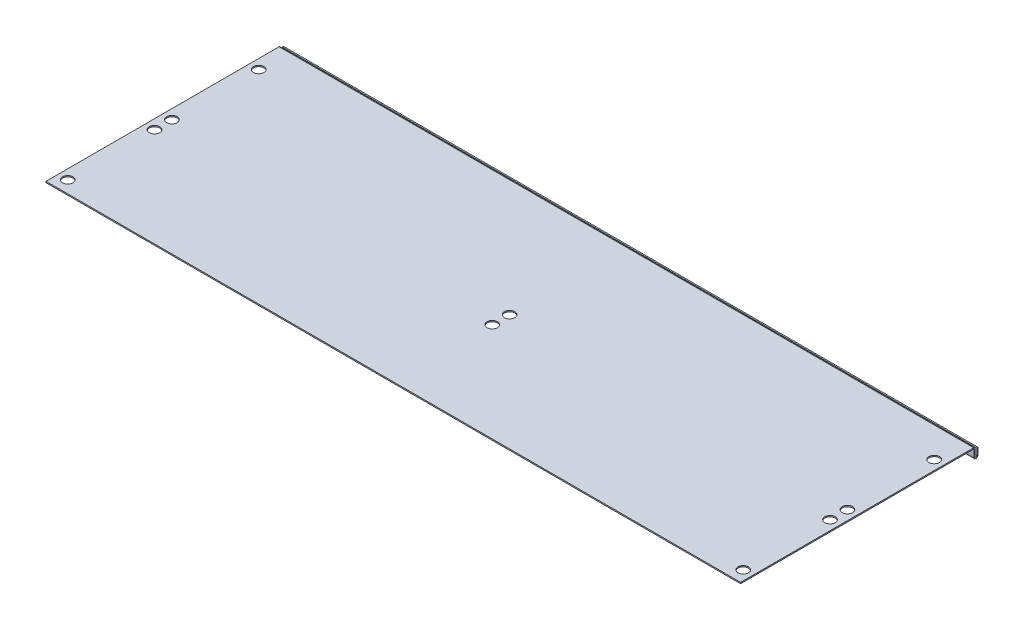
ISO-10303-21;
HEADER;
FILE_DESCRIPTION(('STEP AP214'),'2;1');
FILE_NAME('part.step','',(''),(''),'','','');
FILE_SCHEMA(('AUTOMOTIVE_DESIGN { 1 0 10303 214 1 1 1 1 }'));
ENDSEC;
DATA;
#1=APPLICATION_CONTEXT('core data for automotive mechanical design processes');
#2=APPLICATION_PROTOCOL_DEFINITION('international standard','automotive_design',2000,#1);
#3=PRODUCT_CONTEXT('',#1,'mechanical');
#4=PRODUCT('Part','Part','',(#3));
#5=PRODUCT_RELATED_PRODUCT_CATEGORY('part','',(#4));
#6=PRODUCT_DEFINITION_FORMATION('','',#4);
#7=PRODUCT_DEFINITION_CONTEXT('part definition',#1,'design');
#8=PRODUCT_DEFINITION('design','',#6,#7);
#9=PRODUCT_DEFINITION_SHAPE('','',#8);
#10=(LENGTH_UNIT() NAMED_UNIT(*) SI_UNIT(.MILLI.,.METRE.));
#11=(NAMED_UNIT(*) PLANE_ANGLE_UNIT() SI_UNIT($,.RADIAN.));
#12=(NAMED_UNIT(*) SI_UNIT($,.STERADIAN.) SOLID_ANGLE_UNIT());
#13=UNCERTAINTY_MEASURE_WITH_UNIT(LENGTH_MEASURE(1.E-05),#10,'distance_accuracy_value','');
#14=(GEOMETRIC_REPRESENTATION_CONTEXT(3) GLOBAL_UNCERTAINTY_ASSIGNED_CONTEXT((#13)) GLOBAL_UNIT_ASSIGNED_CONTEXT((#10,
#11,#12)) REPRESENTATION_CONTEXT('',''));
#15=CARTESIAN_POINT('',(0.,0.,0.));
#16=DIRECTION('',(0.,0.,1.));
#17=DIRECTION('',(1.,0.,0.));
#18=AXIS2_PLACEMENT_3D('',#15,#16,#17);
#19=CARTESIAN_POINT('',(200.,-0.7,-67.5));
#20=DIRECTION('',(1.,0.,0.));
#21=DIRECTION('',(0.,0.,-1.));
#22=AXIS2_PLACEMENT_3D('',#19,#20,#21);
#23=PLANE('',#22);
#24=DIRECTION('',(0.,0.,-1.));
#25=VECTOR('',#24,1.);
#26=CARTESIAN_POINT('',(200.,-0.7,-67.5));
#27=LINE('',#26,#25);
#28=CARTESIAN_POINT('',(200.,-0.7,67.5));
#29=VERTEX_POINT('',#28);
#30=CARTESIAN_POINT('',(200.,-0.700000000000008,-66.6));
#31=VERTEX_POINT('',#30);
#32=EDGE_CURVE('E281',#29,#31,#27,.T.);
#33=ORIENTED_EDGE('',*,*,#32,.T.);
#34=DIRECTION('',(0.,1.,0.));
#35=VECTOR('',#34,1.);
#36=CARTESIAN_POINT('',(200.,-0.700000000000008,-66.6));
#37=LINE('',#36,#35);
#38=CARTESIAN_POINT('',(200.,0.,-66.6));
#39=VERTEX_POINT('',#38);
#40=EDGE_CURVE('E204',#31,#39,#37,.T.);
#41=ORIENTED_EDGE('',*,*,#40,.T.);
#42=DIRECTION('',(0.,0.,-1.));
#43=VECTOR('',#42,1.);
#44=CARTESIAN_POINT('',(200.,0.,-67.5));
#45=LINE('',#44,#43);
#46=CARTESIAN_POINT('',(200.,0.,67.5));
#47=VERTEX_POINT('',#46);
#48=EDGE_CURVE('E278',#47,#39,#45,.T.);
#49=ORIENTED_EDGE('',*,*,#48,.F.);
#50=DIRECTION('',(0.,1.,0.));
#51=VECTOR('',#50,1.);
#52=CARTESIAN_POINT('',(200.,-0.7,67.5));
#53=LINE('',#52,#51);
#54=EDGE_CURVE('E13',#29,#47,#53,.T.);
#55=ORIENTED_EDGE('',*,*,#54,.F.);
#56=EDGE_LOOP('',(#33,#41,#49,#55));
#57=FACE_BOUND('',#56,.T.);
#58=ADVANCED_FACE('F58',(#57),#23,.T.);
#59=CARTESIAN_POINT('',(0.,-0.7,0.));
#60=DIRECTION('',(0.,1.,0.));
#61=DIRECTION('',(0.,0.,1.));
#62=AXIS2_PLACEMENT_3D('',#59,#60,#61);
#63=PLANE('',#62);
#64=CARTESIAN_POINT('',(-194.5,-0.7,60.5));
#65=DIRECTION('',(0.,1.,0.));
#66=DIRECTION('',(0.,0.,1.));
#67=AXIS2_PLACEMENT_3D('',#64,#65,#66);
#68=CIRCLE('',#67,2.99999999999999);
#69=CARTESIAN_POINT('',(-194.5,-0.7,63.5));
#70=VERTEX_POINT('',#69);
#71=EDGE_CURVE('E275',#70,#70,#68,.T.);
#72=ORIENTED_EDGE('',*,*,#71,.T.);
#73=EDGE_LOOP('',(#72));
#74=FACE_BOUND('',#73,.T.);
#75=CARTESIAN_POINT('',(-194.5,-0.7,10.5));
#76=DIRECTION('',(0.,1.,0.));
#77=DIRECTION('',(0.,0.,1.));
#78=AXIS2_PLACEMENT_3D('',#75,#76,#77);
#79=CIRCLE('',#78,2.99999999999999);
#80=CARTESIAN_POINT('',(-194.5,-0.7,13.5));
#81=VERTEX_POINT('',#80);
#82=EDGE_CURVE('E269',#81,#81,#79,.T.);
#83=ORIENTED_EDGE('',*,*,#82,.T.);
#84=EDGE_LOOP('',(#83));
#85=FACE_BOUND('',#84,.T.);
#86=CARTESIAN_POINT('',(-194.5,-0.7,0.500000000000002));
#87=DIRECTION('',(0.,1.,0.));
#88=DIRECTION('',(0.,0.,1.));
#89=AXIS2_PLACEMENT_3D('',#86,#87,#88);
#90=CIRCLE('',#89,2.99999999999999);
#91=CARTESIAN_POINT('',(-194.5,-0.7,3.5));
#92=VERTEX_POINT('',#91);
#93=EDGE_CURVE('E263',#92,#92,#90,.T.);
#94=ORIENTED_EDGE('',*,*,#93,.T.);
#95=EDGE_LOOP('',(#94));
#96=FACE_BOUND('',#95,.T.);
#97=CARTESIAN_POINT('',(-194.5,-0.7,-49.5));
#98=DIRECTION('',(0.,1.,0.));
#99=DIRECTION('',(0.,0.,1.));
#100=AXIS2_PLACEMENT_3D('',#97,#98,#99);
#101=CIRCLE('',#100,2.99999999999999);
#102=CARTESIAN_POINT('',(-194.5,-0.7,-46.5));
#103=VERTEX_POINT('',#102);
#104=EDGE_CURVE('E257',#103,#103,#101,.T.);
#105=ORIENTED_EDGE('',*,*,#104,.T.);
#106=EDGE_LOOP('',(#105));
#107=FACE_BOUND('',#106,.T.);
#108=CARTESIAN_POINT('',(194.5,-0.7,60.5));
#109=DIRECTION('',(0.,1.,0.));
#110=DIRECTION('',(0.,0.,-1.));
#111=AXIS2_PLACEMENT_3D('',#108,#109,#110);
#112=CIRCLE('',#111,2.99999999999999);
#113=CARTESIAN_POINT('',(194.5,-0.7,57.5));
#114=VERTEX_POINT('',#113);
#115=EDGE_CURVE('E251',#114,#114,#112,.T.);
#116=ORIENTED_EDGE('',*,*,#115,.T.);
#117=EDGE_LOOP('',(#116));
#118=FACE_BOUND('',#117,.T.);
#119=CARTESIAN_POINT('',(194.5,-0.7,10.5));
#120=DIRECTION('',(0.,1.,0.));
#121=DIRECTION('',(0.,0.,-1.));
#122=AXIS2_PLACEMENT_3D('',#119,#120,#121);
#123=CIRCLE('',#122,2.99999999999999);
#124=CARTESIAN_POINT('',(194.5,-0.7,7.49999999999996));
#125=VERTEX_POINT('',#124);
#126=EDGE_CURVE('E245',#125,#125,#123,.T.);
#127=ORIENTED_EDGE('',*,*,#126,.T.);
#128=EDGE_LOOP('',(#127));
#129=FACE_BOUND('',#128,.T.);
#130=CARTESIAN_POINT('',(194.5,-0.7,0.499999999999955));
#131=DIRECTION('',(0.,1.,0.));
#132=DIRECTION('',(0.,0.,-1.));
#133=AXIS2_PLACEMENT_3D('',#130,#131,#132);
#134=CIRCLE('',#133,2.99999999999999);
#135=CARTESIAN_POINT('',(194.5,-0.7,-2.50000000000004));
#136=VERTEX_POINT('',#135);
#137=EDGE_CURVE('E239',#136,#136,#134,.T.);
#138=ORIENTED_EDGE('',*,*,#137,.T.);
#139=EDGE_LOOP('',(#138));
#140=FACE_BOUND('',#139,.T.);
#141=CARTESIAN_POINT('',(194.5,-0.7,-49.5));
#142=DIRECTION('',(0.,1.,0.));
#143=DIRECTION('',(0.,0.,-1.));
#144=AXIS2_PLACEMENT_3D('',#141,#142,#143);
#145=CIRCLE('',#144,2.99999999999999);
#146=CARTESIAN_POINT('',(194.5,-0.7,-52.5));
#147=VERTEX_POINT('',#146);
#148=EDGE_CURVE('E233',#147,#147,#145,.T.);
#149=ORIENTED_EDGE('',*,*,#148,.T.);
#150=EDGE_LOOP('',(#149));
#151=FACE_BOUND('',#150,.T.);
#152=CARTESIAN_POINT('',(0.,-0.7,10.5));
#153=DIRECTION('',(0.,1.,0.));
#154=DIRECTION('',(0.,0.,1.));
#155=AXIS2_PLACEMENT_3D('',#152,#153,#154);
#156=CIRCLE('',#155,3.);
#157=CARTESIAN_POINT('',(0.,-0.7,13.5));
#158=VERTEX_POINT('',#157);
#159=EDGE_CURVE('E227',#158,#158,#156,.T.);
#160=ORIENTED_EDGE('',*,*,#159,.T.);
#161=EDGE_LOOP('',(#160));
#162=FACE_BOUND('',#161,.T.);
#163=CARTESIAN_POINT('',(0.,-0.7,0.500000000000002));
#164=DIRECTION('',(0.,1.,0.));
#165=DIRECTION('',(0.,0.,1.));
#166=AXIS2_PLACEMENT_3D('',#163,#164,#165);
#167=CIRCLE('',#166,3.);
#168=CARTESIAN_POINT('',(0.,-0.7,3.5));
#169=VERTEX_POINT('',#168);
#170=EDGE_CURVE('E221',#169,#169,#167,.T.);
#171=ORIENTED_EDGE('',*,*,#170,.T.);
#172=EDGE_LOOP('',(#171));
#173=FACE_BOUND('',#172,.T.);
#174=DIRECTION('',(1.,0.,0.));
#175=VECTOR('',#174,1.);
#176=CARTESIAN_POINT('',(200.,-0.700000000000008,-66.6));
#177=LINE('',#176,#175);
#178=CARTESIAN_POINT('',(-200.,-0.700000000000008,-66.6));
#179=VERTEX_POINT('',#178);
#180=EDGE_CURVE('E210',#31,#179,#177,.F.);
#181=ORIENTED_EDGE('',*,*,#180,.F.);
#182=ORIENTED_EDGE('',*,*,#32,.F.);
#183=DIRECTION('',(1.,0.,0.));
#184=VECTOR('',#183,1.);
#185=CARTESIAN_POINT('',(-200.,-0.7,67.5));
#186=LINE('',#185,#184);
#187=CARTESIAN_POINT('',(-200.,-0.7,67.5));
#188=VERTEX_POINT('',#187);
#189=EDGE_CURVE('E287',#188,#29,#186,.T.);
#190=ORIENTED_EDGE('',*,*,#189,.F.);
#191=DIRECTION('',(0.,0.,1.));
#192=VECTOR('',#191,1.);
#193=CARTESIAN_POINT('',(-200.,-0.7,-67.5));
#194=LINE('',#193,#192);
#195=EDGE_CURVE('E284',#179,#188,#194,.T.);
#196=ORIENTED_EDGE('',*,*,#195,.F.);
#197=EDGE_LOOP('',(#181,#182,#190,#196));
#198=FACE_BOUND('',#197,.T.);
#199=ADVANCED_FACE('F316',(#74,#85,#96,#107,#118,#129,#140,#151,#162,#173,#198),#63,.F.);
#200=CARTESIAN_POINT('',(0.,0.,0.));
#201=DIRECTION('',(0.,1.,0.));
#202=DIRECTION('',(0.,0.,1.));
#203=AXIS2_PLACEMENT_3D('',#200,#201,#202);
#204=PLANE('',#203);
#205=CARTESIAN_POINT('',(0.,0.,0.500000000000002));
#206=DIRECTION('',(0.,1.,0.));
#207=DIRECTION('',(0.,0.,1.));
#208=AXIS2_PLACEMENT_3D('',#205,#206,#207);
#209=CIRCLE('',#208,3.);
#210=CARTESIAN_POINT('',(0.,0.,3.5));
#211=VERTEX_POINT('',#210);
#212=EDGE_CURVE('E218',#211,#211,#209,.T.);
#213=ORIENTED_EDGE('',*,*,#212,.F.);
#214=EDGE_LOOP('',(#213));
#215=FACE_BOUND('',#214,.T.);
#216=CARTESIAN_POINT('',(0.,0.,10.5));
#217=DIRECTION('',(0.,1.,0.));
#218=DIRECTION('',(0.,0.,1.));
#219=AXIS2_PLACEMENT_3D('',#216,#217,#218);
#220=CIRCLE('',#219,3.);
#221=CARTESIAN_POINT('',(0.,0.,13.5));
#222=VERTEX_POINT('',#221);
#223=EDGE_CURVE('E224',#222,#222,#220,.T.);
#224=ORIENTED_EDGE('',*,*,#223,.F.);
#225=EDGE_LOOP('',(#224));
#226=FACE_BOUND('',#225,.T.);
#227=CARTESIAN_POINT('',(194.5,0.,-49.5));
#228=DIRECTION('',(0.,1.,0.));
#229=DIRECTION('',(0.,0.,-1.));
#230=AXIS2_PLACEMENT_3D('',#227,#228,#229);
#231=CIRCLE('',#230,2.99999999999999);
#232=CARTESIAN_POINT('',(194.5,0.,-52.5));
#233=VERTEX_POINT('',#232);
#234=EDGE_CURVE('E230',#233,#233,#231,.T.);
#235=ORIENTED_EDGE('',*,*,#234,.F.);
#236=EDGE_LOOP('',(#235));
#237=FACE_BOUND('',#236,.T.);
#238=CARTESIAN_POINT('',(194.5,0.,0.499999999999955));
#239=DIRECTION('',(0.,1.,0.));
#240=DIRECTION('',(0.,0.,-1.));
#241=AXIS2_PLACEMENT_3D('',#238,#239,#240);
#242=CIRCLE('',#241,2.99999999999999);
#243=CARTESIAN_POINT('',(194.5,0.,-2.50000000000004));
#244=VERTEX_POINT('',#243);
#245=EDGE_CURVE('E236',#244,#244,#242,.T.);
#246=ORIENTED_EDGE('',*,*,#245,.F.);
#247=EDGE_LOOP('',(#246));
#248=FACE_BOUND('',#247,.T.);
#249=CARTESIAN_POINT('',(194.5,0.,10.5));
#250=DIRECTION('',(0.,1.,0.));
#251=DIRECTION('',(0.,0.,-1.));
#252=AXIS2_PLACEMENT_3D('',#249,#250,#251);
#253=CIRCLE('',#252,2.99999999999999);
#254=CARTESIAN_POINT('',(194.5,0.,7.49999999999996));
#255=VERTEX_POINT('',#254);
#256=EDGE_CURVE('E242',#255,#255,#253,.T.);
#257=ORIENTED_EDGE('',*,*,#256,.F.);
#258=EDGE_LOOP('',(#257));
#259=FACE_BOUND('',#258,.T.);
#260=CARTESIAN_POINT('',(194.5,0.,60.5));
#261=DIRECTION('',(0.,1.,0.));
#262=DIRECTION('',(0.,0.,-1.));
#263=AXIS2_PLACEMENT_3D('',#260,#261,#262);
#264=CIRCLE('',#263,2.99999999999999);
#265=CARTESIAN_POINT('',(194.5,0.,57.5));
#266=VERTEX_POINT('',#265);
#267=EDGE_CURVE('E248',#266,#266,#264,.T.);
#268=ORIENTED_EDGE('',*,*,#267,.F.);
#269=EDGE_LOOP('',(#268));
#270=FACE_BOUND('',#269,.T.);
#271=CARTESIAN_POINT('',(-194.5,0.,-49.5));
#272=DIRECTION('',(0.,1.,0.));
#273=DIRECTION('',(0.,0.,1.));
#274=AXIS2_PLACEMENT_3D('',#271,#272,#273);
#275=CIRCLE('',#274,2.99999999999999);
#276=CARTESIAN_POINT('',(-194.5,0.,-46.5));
#277=VERTEX_POINT('',#276);
#278=EDGE_CURVE('E254',#277,#277,#275,.T.);
#279=ORIENTED_EDGE('',*,*,#278,.F.);
#280=EDGE_LOOP('',(#279));
#281=FACE_BOUND('',#280,.T.);
#282=CARTESIAN_POINT('',(-194.5,0.,0.500000000000002));
#283=DIRECTION('',(0.,1.,0.));
#284=DIRECTION('',(0.,0.,1.));
#285=AXIS2_PLACEMENT_3D('',#282,#283,#284);
#286=CIRCLE('',#285,2.99999999999999);
#287=CARTESIAN_POINT('',(-194.5,0.,3.5));
#288=VERTEX_POINT('',#287);
#289=EDGE_CURVE('E260',#288,#288,#286,.T.);
#290=ORIENTED_EDGE('',*,*,#289,.F.);
#291=EDGE_LOOP('',(#290));
#292=FACE_BOUND('',#291,.T.);
#293=CARTESIAN_POINT('',(-194.5,0.,10.5));
#294=DIRECTION('',(0.,1.,0.));
#295=DIRECTION('',(0.,0.,1.));
#296=AXIS2_PLACEMENT_3D('',#293,#294,#295);
#297=CIRCLE('',#296,2.99999999999999);
#298=CARTESIAN_POINT('',(-194.5,0.,13.5));
#299=VERTEX_POINT('',#298);
#300=EDGE_CURVE('E266',#299,#299,#297,.T.);
#301=ORIENTED_EDGE('',*,*,#300,.F.);
#302=EDGE_LOOP('',(#301));
#303=FACE_BOUND('',#302,.T.);
#304=CARTESIAN_POINT('',(-194.5,0.,60.5));
#305=DIRECTION('',(0.,1.,0.));
#306=DIRECTION('',(0.,0.,1.));
#307=AXIS2_PLACEMENT_3D('',#304,#305,#306);
#308=CIRCLE('',#307,2.99999999999999);
#309=CARTESIAN_POINT('',(-194.5,0.,63.5));
#310=VERTEX_POINT('',#309);
#311=EDGE_CURVE('E272',#310,#310,#308,.T.);
#312=ORIENTED_EDGE('',*,*,#311,.F.);
#313=EDGE_LOOP('',(#312));
#314=FACE_BOUND('',#313,.T.);
#315=ORIENTED_EDGE('',*,*,#48,.T.);
#316=DIRECTION('',(1.,0.,0.));
#317=VECTOR('',#316,1.);
#318=CARTESIAN_POINT('',(200.,0.,-66.6));
#319=LINE('',#318,#317);
#320=CARTESIAN_POINT('',(-200.,0.,-66.6));
#321=VERTEX_POINT('',#320);
#322=EDGE_CURVE('E199',#39,#321,#319,.F.);
#323=ORIENTED_EDGE('',*,*,#322,.T.);
#324=DIRECTION('',(0.,0.,1.));
#325=VECTOR('',#324,1.);
#326=CARTESIAN_POINT('',(-200.,0.,-67.5));
#327=LINE('',#326,#325);
#328=CARTESIAN_POINT('',(-200.,0.,67.5));
#329=VERTEX_POINT('',#328);
#330=EDGE_CURVE('E292',#321,#329,#327,.T.);
#331=ORIENTED_EDGE('',*,*,#330,.T.);
#332=DIRECTION('',(1.,0.,0.));
#333=VECTOR('',#332,1.);
#334=CARTESIAN_POINT('',(-200.,0.,67.5));
#335=LINE('',#334,#333);
#336=EDGE_CURVE('E285',#329,#47,#335,.T.);
#337=ORIENTED_EDGE('',*,*,#336,.T.);
#338=EDGE_LOOP('',(#315,#323,#331,#337));
#339=FACE_BOUND('',#338,.T.);
#340=ADVANCED_FACE('F297',(#215,#226,#237,#248,#259,#270,#281,#292,#303,#314,#339),#204,.T.);
#341=CARTESIAN_POINT('',(-200.,-0.7,67.5));
#342=DIRECTION('',(0.,0.,1.));
#343=DIRECTION('',(1.,0.,0.));
#344=AXIS2_PLACEMENT_3D('',#341,#342,#343);
#345=PLANE('',#344);
#346=ORIENTED_EDGE('',*,*,#336,.F.);
#347=DIRECTION('',(0.,1.,0.));
#348=VECTOR('',#347,1.);
#349=CARTESIAN_POINT('',(-200.,-0.7,67.5));
#350=LINE('',#349,#348);
#351=EDGE_CURVE('E61',#188,#329,#350,.T.);
#352=ORIENTED_EDGE('',*,*,#351,.F.);
#353=ORIENTED_EDGE('',*,*,#189,.T.);
#354=ORIENTED_EDGE('',*,*,#54,.T.);
#355=EDGE_LOOP('',(#346,#352,#353,#354));
#356=FACE_BOUND('',#355,.T.);
#357=ADVANCED_FACE('F303',(#356),#345,.T.);
#358=CARTESIAN_POINT('',(-200.,-0.7,-67.5));
#359=DIRECTION('',(-1.,0.,0.));
#360=DIRECTION('',(0.,0.,1.));
#361=AXIS2_PLACEMENT_3D('',#358,#359,#360);
#362=PLANE('',#361);
#363=DIRECTION('',(0.,1.,0.));
#364=VECTOR('',#363,1.);
#365=CARTESIAN_POINT('',(-200.,-0.700000000000008,-66.6));
#366=LINE('',#365,#364);
#367=EDGE_CURVE('E216',#179,#321,#366,.T.);
#368=ORIENTED_EDGE('',*,*,#367,.F.);
#369=ORIENTED_EDGE('',*,*,#195,.T.);
#370=ORIENTED_EDGE('',*,*,#351,.T.);
#371=ORIENTED_EDGE('',*,*,#330,.F.);
#372=EDGE_LOOP('',(#368,#369,#370,#371));
#373=FACE_BOUND('',#372,.T.);
#374=ADVANCED_FACE('F319',(#373),#362,.T.);
#375=CARTESIAN_POINT('',(-194.5,-0.7,60.5));
#376=DIRECTION('',(0.,1.,0.));
#377=DIRECTION('',(0.,0.,1.));
#378=AXIS2_PLACEMENT_3D('',#375,#376,#377);
#379=CYLINDRICAL_SURFACE('',#378,2.99999999999999);
#380=ORIENTED_EDGE('',*,*,#71,.F.);
#381=EDGE_LOOP('',(#380));
#382=FACE_BOUND('',#381,.T.);
#383=ORIENTED_EDGE('',*,*,#311,.T.);
#384=EDGE_LOOP('',(#383));
#385=FACE_BOUND('',#384,.T.);
#386=ADVANCED_FACE('F400',(#382,#385),#379,.F.);
#387=CARTESIAN_POINT('',(-194.5,-0.7,10.5));
#388=DIRECTION('',(0.,1.,0.));
#389=DIRECTION('',(0.,0.,1.));
#390=AXIS2_PLACEMENT_3D('',#387,#388,#389);
#391=CYLINDRICAL_SURFACE('',#390,2.99999999999999);
#392=ORIENTED_EDGE('',*,*,#82,.F.);
#393=EDGE_LOOP('',(#392));
#394=FACE_BOUND('',#393,.T.);
#395=ORIENTED_EDGE('',*,*,#300,.T.);
#396=EDGE_LOOP('',(#395));
#397=FACE_BOUND('',#396,.T.);
#398=ADVANCED_FACE('F408',(#394,#397),#391,.F.);
#399=CARTESIAN_POINT('',(-194.5,-0.7,0.500000000000002));
#400=DIRECTION('',(0.,1.,0.));
#401=DIRECTION('',(0.,0.,1.));
#402=AXIS2_PLACEMENT_3D('',#399,#400,#401);
#403=CYLINDRICAL_SURFACE('',#402,2.99999999999999);
#404=ORIENTED_EDGE('',*,*,#93,.F.);
#405=EDGE_LOOP('',(#404));
#406=FACE_BOUND('',#405,.T.);
#407=ORIENTED_EDGE('',*,*,#289,.T.);
#408=EDGE_LOOP('',(#407));
#409=FACE_BOUND('',#408,.T.);
#410=ADVANCED_FACE('F413',(#406,#409),#403,.F.);
#411=CARTESIAN_POINT('',(-194.5,-0.7,-49.5));
#412=DIRECTION('',(0.,1.,0.));
#413=DIRECTION('',(0.,0.,1.));
#414=AXIS2_PLACEMENT_3D('',#411,#412,#413);
#415=CYLINDRICAL_SURFACE('',#414,2.99999999999999);
#416=ORIENTED_EDGE('',*,*,#104,.F.);
#417=EDGE_LOOP('',(#416));
#418=FACE_BOUND('',#417,.T.);
#419=ORIENTED_EDGE('',*,*,#278,.T.);
#420=EDGE_LOOP('',(#419));
#421=FACE_BOUND('',#420,.T.);
#422=ADVANCED_FACE('F422',(#418,#421),#415,.F.);
#423=CARTESIAN_POINT('',(194.5,-0.7,60.5));
#424=DIRECTION('',(0.,1.,0.));
#425=DIRECTION('',(0.,0.,1.));
#426=AXIS2_PLACEMENT_3D('',#423,#424,#425);
#427=CYLINDRICAL_SURFACE('',#426,2.99999999999999);
#428=ORIENTED_EDGE('',*,*,#115,.F.);
#429=EDGE_LOOP('',(#428));
#430=FACE_BOUND('',#429,.T.);
#431=ORIENTED_EDGE('',*,*,#267,.T.);
#432=EDGE_LOOP('',(#431));
#433=FACE_BOUND('',#432,.T.);
#434=ADVANCED_FACE('F430',(#430,#433),#427,.F.);
#435=CARTESIAN_POINT('',(194.5,-0.7,10.5));
#436=DIRECTION('',(0.,1.,0.));
#437=DIRECTION('',(0.,0.,1.));
#438=AXIS2_PLACEMENT_3D('',#435,#436,#437);
#439=CYLINDRICAL_SURFACE('',#438,2.99999999999999);
#440=ORIENTED_EDGE('',*,*,#126,.F.);
#441=EDGE_LOOP('',(#440));
#442=FACE_BOUND('',#441,.T.);
#443=ORIENTED_EDGE('',*,*,#256,.T.);
#444=EDGE_LOOP('',(#443));
#445=FACE_BOUND('',#444,.T.);
#446=ADVANCED_FACE('F434',(#442,#445),#439,.F.);
#447=CARTESIAN_POINT('',(194.5,-0.7,0.499999999999955));
#448=DIRECTION('',(0.,1.,0.));
#449=DIRECTION('',(0.,0.,1.));
#450=AXIS2_PLACEMENT_3D('',#447,#448,#449);
#451=CYLINDRICAL_SURFACE('',#450,2.99999999999999);
#452=ORIENTED_EDGE('',*,*,#137,.F.);
#453=EDGE_LOOP('',(#452));
#454=FACE_BOUND('',#453,.T.);
#455=ORIENTED_EDGE('',*,*,#245,.T.);
#456=EDGE_LOOP('',(#455));
#457=FACE_BOUND('',#456,.T.);
#458=ADVANCED_FACE('F438',(#454,#457),#451,.F.);
#459=CARTESIAN_POINT('',(194.5,-0.7,-49.5));
#460=DIRECTION('',(0.,1.,0.));
#461=DIRECTION('',(0.,0.,1.));
#462=AXIS2_PLACEMENT_3D('',#459,#460,#461);
#463=CYLINDRICAL_SURFACE('',#462,2.99999999999999);
#464=ORIENTED_EDGE('',*,*,#148,.F.);
#465=EDGE_LOOP('',(#464));
#466=FACE_BOUND('',#465,.T.);
#467=ORIENTED_EDGE('',*,*,#234,.T.);
#468=EDGE_LOOP('',(#467));
#469=FACE_BOUND('',#468,.T.);
#470=ADVANCED_FACE('F442',(#466,#469),#463,.F.);
#471=CARTESIAN_POINT('',(0.,-0.7,10.5));
#472=DIRECTION('',(0.,1.,0.));
#473=DIRECTION('',(0.,0.,1.));
#474=AXIS2_PLACEMENT_3D('',#471,#472,#473);
#475=CYLINDRICAL_SURFACE('',#474,3.);
#476=ORIENTED_EDGE('',*,*,#159,.F.);
#477=EDGE_LOOP('',(#476));
#478=FACE_BOUND('',#477,.T.);
#479=ORIENTED_EDGE('',*,*,#223,.T.);
#480=EDGE_LOOP('',(#479));
#481=FACE_BOUND('',#480,.T.);
#482=ADVANCED_FACE('F446',(#478,#481),#475,.F.);
#483=CARTESIAN_POINT('',(0.,-0.7,0.500000000000002));
#484=DIRECTION('',(0.,1.,0.));
#485=DIRECTION('',(0.,0.,1.));
#486=AXIS2_PLACEMENT_3D('',#483,#484,#485);
#487=CYLINDRICAL_SURFACE('',#486,3.);
#488=ORIENTED_EDGE('',*,*,#170,.F.);
#489=EDGE_LOOP('',(#488));
#490=FACE_BOUND('',#489,.T.);
#491=ORIENTED_EDGE('',*,*,#212,.T.);
#492=EDGE_LOOP('',(#491));
#493=FACE_BOUND('',#492,.T.);
#494=ADVANCED_FACE('F450',(#490,#493),#487,.F.);
#495=CARTESIAN_POINT('',(-200.,-0.900000000000013,-66.6));
#496=DIRECTION('',(-1.,0.,0.));
#497=DIRECTION('',(0.,0.,1.));
#498=AXIS2_PLACEMENT_3D('',#495,#496,#497);
#499=PLANE('',#498);
#500=DIRECTION('',(0.,0.,1.));
#501=VECTOR('',#500,1.);
#502=CARTESIAN_POINT('',(-200.,-0.900000000000007,-67.5));
#503=LINE('',#502,#501);
#504=CARTESIAN_POINT('',(-200.,-0.900000000000013,-66.8));
#505=VERTEX_POINT('',#504);
#506=CARTESIAN_POINT('',(-200.,-0.900000000000011,-67.5));
#507=VERTEX_POINT('',#506);
#508=EDGE_CURVE('E195',#505,#507,#503,.F.);
#509=ORIENTED_EDGE('',*,*,#508,.F.);
#510=CARTESIAN_POINT('',(-200.,-0.900000000000013,-66.6));
#511=DIRECTION('',(1.,0.,0.));
#512=DIRECTION('',(0.,0.,-1.));
#513=AXIS2_PLACEMENT_3D('',#510,#511,#512);
#514=CIRCLE('',#513,0.200000000000006);
#515=EDGE_CURVE('E207',#179,#505,#514,.F.);
#516=ORIENTED_EDGE('',*,*,#515,.F.);
#517=ORIENTED_EDGE('',*,*,#367,.T.);
#518=CARTESIAN_POINT('',(-200.,-0.900000000000013,-66.6));
#519=DIRECTION('',(1.,0.,0.));
#520=DIRECTION('',(0.,0.,-1.));
#521=AXIS2_PLACEMENT_3D('',#518,#519,#520);
#522=CIRCLE('',#521,0.900000000000006);
#523=EDGE_CURVE('E80',#321,#507,#522,.F.);
#524=ORIENTED_EDGE('',*,*,#523,.T.);
#525=EDGE_LOOP('',(#509,#516,#517,#524));
#526=FACE_BOUND('',#525,.T.);
#527=ADVANCED_FACE('F322',(#526),#499,.T.);
#528=CARTESIAN_POINT('',(200.,-0.900000000000013,-66.6));
#529=DIRECTION('',(-1.,0.,0.));
#530=DIRECTION('',(0.,0.,1.));
#531=AXIS2_PLACEMENT_3D('',#528,#529,#530);
#532=PLANE('',#531);
#533=CARTESIAN_POINT('',(200.,-0.900000000000013,-66.6));
#534=DIRECTION('',(1.,0.,0.));
#535=DIRECTION('',(0.,0.,-1.));
#536=AXIS2_PLACEMENT_3D('',#533,#534,#535);
#537=CIRCLE('',#536,0.200000000000006);
#538=CARTESIAN_POINT('',(200.,-0.900000000000013,-66.8));
#539=VERTEX_POINT('',#538);
#540=EDGE_CURVE('E212',#539,#31,#537,.T.);
#541=ORIENTED_EDGE('',*,*,#540,.F.);
#542=DIRECTION('',(0.,0.,1.));
#543=VECTOR('',#542,1.);
#544=CARTESIAN_POINT('',(200.,-0.900000000000012,-66.8));
#545=LINE('',#544,#543);
#546=CARTESIAN_POINT('',(200.,-0.900000000000007,-67.5));
#547=VERTEX_POINT('',#546);
#548=EDGE_CURVE('E184',#539,#547,#545,.F.);
#549=ORIENTED_EDGE('',*,*,#548,.T.);
#550=CARTESIAN_POINT('',(200.,-0.900000000000013,-66.6));
#551=DIRECTION('',(1.,0.,0.));
#552=DIRECTION('',(0.,0.,-1.));
#553=AXIS2_PLACEMENT_3D('',#550,#551,#552);
#554=CIRCLE('',#553,0.900000000000006);
#555=EDGE_CURVE('E202',#547,#39,#554,.T.);
#556=ORIENTED_EDGE('',*,*,#555,.T.);
#557=ORIENTED_EDGE('',*,*,#40,.F.);
#558=EDGE_LOOP('',(#541,#549,#556,#557));
#559=FACE_BOUND('',#558,.T.);
#560=ADVANCED_FACE('F309',(#559),#532,.F.);
#561=CARTESIAN_POINT('',(200.,-0.900000000000013,-66.6));
#562=DIRECTION('',(1.,0.,0.));
#563=DIRECTION('',(0.,0.,-1.));
#564=AXIS2_PLACEMENT_3D('',#561,#562,#563);
#565=CYLINDRICAL_SURFACE('',#564,0.900000000000006);
#566=ORIENTED_EDGE('',*,*,#322,.F.);
#567=ORIENTED_EDGE('',*,*,#555,.F.);
#568=DIRECTION('',(1.,0.,0.));
#569=VECTOR('',#568,1.);
#570=CARTESIAN_POINT('',(-200.,-0.900000000000007,-67.5));
#571=LINE('',#570,#569);
#572=EDGE_CURVE('E185',#547,#507,#571,.F.);
#573=ORIENTED_EDGE('',*,*,#572,.T.);
#574=ORIENTED_EDGE('',*,*,#523,.F.);
#575=EDGE_LOOP('',(#566,#567,#573,#574));
#576=FACE_BOUND('',#575,.T.);
#577=ADVANCED_FACE('F323',(#576),#565,.T.);
#578=CARTESIAN_POINT('',(200.,-0.900000000000013,-66.6));
#579=DIRECTION('',(1.,0.,0.));
#580=DIRECTION('',(0.,0.,-1.));
#581=AXIS2_PLACEMENT_3D('',#578,#579,#580);
#582=CYLINDRICAL_SURFACE('',#581,0.200000000000006);
#583=ORIENTED_EDGE('',*,*,#180,.T.);
#584=ORIENTED_EDGE('',*,*,#515,.T.);
#585=DIRECTION('',(1.,0.,0.));
#586=VECTOR('',#585,1.);
#587=CARTESIAN_POINT('',(-200.,-0.900000000000012,-66.8));
#588=LINE('',#587,#586);
#589=EDGE_CURVE('E193',#505,#539,#588,.T.);
#590=ORIENTED_EDGE('',*,*,#589,.T.);
#591=ORIENTED_EDGE('',*,*,#540,.T.);
#592=EDGE_LOOP('',(#583,#584,#590,#591));
#593=FACE_BOUND('',#592,.T.);
#594=ADVANCED_FACE('F312',(#593),#582,.F.);
#595=CARTESIAN_POINT('',(200.,-6.,-67.5));
#596=DIRECTION('',(-1.,0.,0.));
#597=DIRECTION('',(0.,0.,1.));
#598=AXIS2_PLACEMENT_3D('',#595,#596,#597);
#599=PLANE('',#598);
#600=DIRECTION('',(0.,1.,0.));
#601=VECTOR('',#600,1.);
#602=CARTESIAN_POINT('',(200.,-6.,-66.8));
#603=LINE('',#602,#601);
#604=CARTESIAN_POINT('',(200.,-4.8,-66.8));
#605=VERTEX_POINT('',#604);
#606=EDGE_CURVE('E176',#539,#605,#603,.F.);
#607=ORIENTED_EDGE('',*,*,#606,.T.);
#608=DIRECTION('',(0.,0.,1.));
#609=VECTOR('',#608,1.);
#610=CARTESIAN_POINT('',(200.,-4.8,-67.5));
#611=LINE('',#610,#609);
#612=CARTESIAN_POINT('',(200.,-4.8,-67.5));
#613=VERTEX_POINT('',#612);
#614=EDGE_CURVE('E148',#613,#605,#611,.T.);
#615=ORIENTED_EDGE('',*,*,#614,.F.);
#616=DIRECTION('',(0.,-1.,0.));
#617=VECTOR('',#616,1.);
#618=CARTESIAN_POINT('',(200.,1.79189447697091E-13,-67.5));
#619=LINE('',#618,#617);
#620=EDGE_CURVE('E187',#547,#613,#619,.T.);
#621=ORIENTED_EDGE('',*,*,#620,.F.);
#622=ORIENTED_EDGE('',*,*,#548,.F.);
#623=EDGE_LOOP('',(#607,#615,#621,#622));
#624=FACE_BOUND('',#623,.T.);
#625=ADVANCED_FACE('F182',(#624),#599,.F.);
#626=CARTESIAN_POINT('',(-200.,-0.699999999999998,-67.5));
#627=DIRECTION('',(1.,0.,0.));
#628=DIRECTION('',(0.,0.,-1.));
#629=AXIS2_PLACEMENT_3D('',#626,#627,#628);
#630=PLANE('',#629);
#631=DIRECTION('',(0.,1.,0.));
#632=VECTOR('',#631,1.);
#633=CARTESIAN_POINT('',(-200.,1.79189447697091E-13,-67.5));
#634=LINE('',#633,#632);
#635=CARTESIAN_POINT('',(-200.,-4.8,-67.5));
#636=VERTEX_POINT('',#635);
#637=EDGE_CURVE('E215',#636,#507,#634,.T.);
#638=ORIENTED_EDGE('',*,*,#637,.F.);
#639=DIRECTION('',(0.,0.,1.));
#640=VECTOR('',#639,1.);
#641=CARTESIAN_POINT('',(-200.,-4.8,-67.5));
#642=LINE('',#641,#640);
#643=CARTESIAN_POINT('',(-200.,-4.8,-66.8));
#644=VERTEX_POINT('',#643);
#645=EDGE_CURVE('E160',#636,#644,#642,.T.);
#646=ORIENTED_EDGE('',*,*,#645,.T.);
#647=DIRECTION('',(0.,-1.,0.));
#648=VECTOR('',#647,1.);
#649=CARTESIAN_POINT('',(-200.,-0.699999999999999,-66.8));
#650=LINE('',#649,#648);
#651=EDGE_CURVE('E177',#644,#505,#650,.F.);
#652=ORIENTED_EDGE('',*,*,#651,.T.);
#653=ORIENTED_EDGE('',*,*,#508,.T.);
#654=EDGE_LOOP('',(#638,#646,#652,#653));
#655=FACE_BOUND('',#654,.T.);
#656=ADVANCED_FACE('F377',(#655),#630,.F.);
#657=CARTESIAN_POINT('',(0.,1.79189447697091E-13,-67.5));
#658=DIRECTION('',(0.,0.,1.));
#659=DIRECTION('',(0.,-1.,0.));
#660=AXIS2_PLACEMENT_3D('',#657,#658,#659);
#661=PLANE('',#660);
#662=ORIENTED_EDGE('',*,*,#620,.T.);
#663=DIRECTION('',(-1.,0.,0.));
#664=VECTOR('',#663,1.);
#665=CARTESIAN_POINT('',(-200.,-4.8,-67.5));
#666=LINE('',#665,#664);
#667=EDGE_CURVE('E362',#636,#613,#666,.F.);
#668=ORIENTED_EDGE('',*,*,#667,.F.);
#669=ORIENTED_EDGE('',*,*,#637,.T.);
#670=ORIENTED_EDGE('',*,*,#572,.F.);
#671=EDGE_LOOP('',(#662,#668,#669,#670));
#672=FACE_BOUND('',#671,.T.);
#673=ADVANCED_FACE('F326',(#672),#661,.F.);
#674=CARTESIAN_POINT('',(0.,1.76745410759901E-13,-66.8));
#675=DIRECTION('',(0.,0.,1.));
#676=DIRECTION('',(0.,-1.,0.));
#677=AXIS2_PLACEMENT_3D('',#674,#675,#676);
#678=PLANE('',#677);
#679=DIRECTION('',(-1.,0.,0.));
#680=VECTOR('',#679,1.);
#681=CARTESIAN_POINT('',(-200.,-4.8,-66.8));
#682=LINE('',#681,#680);
#683=EDGE_CURVE('E167',#644,#605,#682,.F.);
#684=ORIENTED_EDGE('',*,*,#683,.T.);
#685=ORIENTED_EDGE('',*,*,#606,.F.);
#686=ORIENTED_EDGE('',*,*,#589,.F.);
#687=ORIENTED_EDGE('',*,*,#651,.F.);
#688=EDGE_LOOP('',(#684,#685,#686,#687));
#689=FACE_BOUND('',#688,.T.);
#690=ADVANCED_FACE('F174',(#689),#678,.T.);
#691=CARTESIAN_POINT('',(-200.,-2.9,-69.2));
#692=DIRECTION('',(1.,0.,0.));
#693=DIRECTION('',(0.,-1.,0.));
#694=AXIS2_PLACEMENT_3D('',#691,#692,#693);
#695=PLANE('',#694);
#696=DIRECTION('',(0.,0.,-1.));
#697=VECTOR('',#696,1.);
#698=CARTESIAN_POINT('',(-200.,-4.8,-69.2));
#699=LINE('',#698,#697);
#700=CARTESIAN_POINT('',(-200.,-4.8,-68.5));
#701=VERTEX_POINT('',#700);
#702=CARTESIAN_POINT('',(-200.,-4.8,-69.2));
#703=VERTEX_POINT('',#702);
#704=EDGE_CURVE('E337',#701,#703,#699,.T.);
#705=ORIENTED_EDGE('',*,*,#704,.F.);
#706=DIRECTION('',(0.,1.,0.));
#707=VECTOR('',#706,1.);
#708=CARTESIAN_POINT('',(-200.,-2.9,-68.5));
#709=LINE('',#708,#707);
#710=CARTESIAN_POINT('',(-200.,-0.999999999999998,-68.5));
#711=VERTEX_POINT('',#710);
#712=EDGE_CURVE('E345',#711,#701,#709,.F.);
#713=ORIENTED_EDGE('',*,*,#712,.F.);
#714=DIRECTION('',(0.,0.,-1.));
#715=VECTOR('',#714,1.);
#716=CARTESIAN_POINT('',(-200.,-0.999999999999996,-69.2));
#717=LINE('',#716,#715);
#718=CARTESIAN_POINT('',(-200.,-0.999999999999996,-69.2));
#719=VERTEX_POINT('',#718);
#720=EDGE_CURVE('E333',#711,#719,#717,.T.);
#721=ORIENTED_EDGE('',*,*,#720,.T.);
#722=DIRECTION('',(0.,-1.,0.));
#723=VECTOR('',#722,1.);
#724=CARTESIAN_POINT('',(-200.,-2.9,-69.2));
#725=LINE('',#724,#723);
#726=EDGE_CURVE('E355',#719,#703,#725,.T.);
#727=ORIENTED_EDGE('',*,*,#726,.T.);
#728=EDGE_LOOP('',(#705,#713,#721,#727));
#729=FACE_BOUND('',#728,.T.);
#730=ADVANCED_FACE('F369',(#729),#695,.F.);
#731=CARTESIAN_POINT('',(0.,-0.999999999999996,-69.2));
#732=DIRECTION('',(0.,-1.,0.));
#733=DIRECTION('',(-1.,0.,0.));
#734=AXIS2_PLACEMENT_3D('',#731,#732,#733);
#735=PLANE('',#734);
#736=ORIENTED_EDGE('',*,*,#720,.F.);
#737=DIRECTION('',(1.,0.,0.));
#738=VECTOR('',#737,1.);
#739=CARTESIAN_POINT('',(0.,-0.999999999999998,-68.5));
#740=LINE('',#739,#738);
#741=CARTESIAN_POINT('',(200.,-0.999999999999998,-68.5));
#742=VERTEX_POINT('',#741);
#743=EDGE_CURVE('E348',#742,#711,#740,.F.);
#744=ORIENTED_EDGE('',*,*,#743,.F.);
#745=DIRECTION('',(0.,0.,-1.));
#746=VECTOR('',#745,1.);
#747=CARTESIAN_POINT('',(200.,-0.999999999999996,-69.2));
#748=LINE('',#747,#746);
#749=CARTESIAN_POINT('',(200.,-0.999999999999996,-69.2));
#750=VERTEX_POINT('',#749);
#751=EDGE_CURVE('E331',#742,#750,#748,.T.);
#752=ORIENTED_EDGE('',*,*,#751,.T.);
#753=DIRECTION('',(-1.,0.,0.));
#754=VECTOR('',#753,1.);
#755=CARTESIAN_POINT('',(0.,-0.999999999999996,-69.2));
#756=LINE('',#755,#754);
#757=EDGE_CURVE('E334',#750,#719,#756,.T.);
#758=ORIENTED_EDGE('',*,*,#757,.T.);
#759=EDGE_LOOP('',(#736,#744,#752,#758));
#760=FACE_BOUND('',#759,.T.);
#761=ADVANCED_FACE('F504',(#760),#735,.F.);
#762=CARTESIAN_POINT('',(200.,-2.9,-69.2));
#763=DIRECTION('',(-1.,0.,0.));
#764=DIRECTION('',(0.,1.,0.));
#765=AXIS2_PLACEMENT_3D('',#762,#763,#764);
#766=PLANE('',#765);
#767=DIRECTION('',(0.,1.,0.));
#768=VECTOR('',#767,1.);
#769=CARTESIAN_POINT('',(200.,-2.9,-68.5));
#770=LINE('',#769,#768);
#771=CARTESIAN_POINT('',(200.,-4.8,-68.5));
#772=VERTEX_POINT('',#771);
#773=EDGE_CURVE('E159',#772,#742,#770,.T.);
#774=ORIENTED_EDGE('',*,*,#773,.F.);
#775=DIRECTION('',(0.,0.,-1.));
#776=VECTOR('',#775,1.);
#777=CARTESIAN_POINT('',(200.,-4.8,-69.2));
#778=LINE('',#777,#776);
#779=CARTESIAN_POINT('',(200.,-4.79999999999999,-69.2));
#780=VERTEX_POINT('',#779);
#781=EDGE_CURVE('E198',#772,#780,#778,.T.);
#782=ORIENTED_EDGE('',*,*,#781,.T.);
#783=DIRECTION('',(0.,1.,0.));
#784=VECTOR('',#783,1.);
#785=CARTESIAN_POINT('',(200.,-2.9,-69.2));
#786=LINE('',#785,#784);
#787=EDGE_CURVE('E351',#780,#750,#786,.T.);
#788=ORIENTED_EDGE('',*,*,#787,.T.);
#789=ORIENTED_EDGE('',*,*,#751,.F.);
#790=EDGE_LOOP('',(#774,#782,#788,#789));
#791=FACE_BOUND('',#790,.T.);
#792=ADVANCED_FACE('F514',(#791),#766,.F.);
#793=CARTESIAN_POINT('',(0.,-2.9,-69.2));
#794=DIRECTION('',(0.,0.,-1.));
#795=DIRECTION('',(0.,1.,0.));
#796=AXIS2_PLACEMENT_3D('',#793,#794,#795);
#797=PLANE('',#796);
#798=ORIENTED_EDGE('',*,*,#757,.F.);
#799=ORIENTED_EDGE('',*,*,#787,.F.);
#800=DIRECTION('',(1.,0.,0.));
#801=VECTOR('',#800,1.);
#802=CARTESIAN_POINT('',(0.,-4.8,-69.2));
#803=LINE('',#802,#801);
#804=EDGE_CURVE('E169',#703,#780,#803,.T.);
#805=ORIENTED_EDGE('',*,*,#804,.F.);
#806=ORIENTED_EDGE('',*,*,#726,.F.);
#807=EDGE_LOOP('',(#798,#799,#805,#806));
#808=FACE_BOUND('',#807,.T.);
#809=ADVANCED_FACE('F525',(#808),#797,.T.);
#810=CARTESIAN_POINT('',(0.,-2.9,-68.5));
#811=DIRECTION('',(0.,0.,-1.));
#812=DIRECTION('',(0.,1.,0.));
#813=AXIS2_PLACEMENT_3D('',#810,#811,#812);
#814=PLANE('',#813);
#815=ORIENTED_EDGE('',*,*,#743,.T.);
#816=ORIENTED_EDGE('',*,*,#712,.T.);
#817=DIRECTION('',(1.,0.,0.));
#818=VECTOR('',#817,1.);
#819=CARTESIAN_POINT('',(0.,-4.8,-68.5));
#820=LINE('',#819,#818);
#821=EDGE_CURVE('E343',#701,#772,#820,.T.);
#822=ORIENTED_EDGE('',*,*,#821,.T.);
#823=ORIENTED_EDGE('',*,*,#773,.T.);
#824=EDGE_LOOP('',(#815,#816,#822,#823));
#825=FACE_BOUND('',#824,.T.);
#826=ADVANCED_FACE('F372',(#825),#814,.F.);
#827=CARTESIAN_POINT('',(200.,-4.8,-68.));
#828=DIRECTION('',(1.,0.,0.));
#829=DIRECTION('',(0.,0.,-1.));
#830=AXIS2_PLACEMENT_3D('',#827,#828,#829);
#831=PLANE('',#830);
#832=ORIENTED_EDGE('',*,*,#781,.F.);
#833=CARTESIAN_POINT('',(200.,-4.8,-68.));
#834=DIRECTION('',(-1.,0.,0.));
#835=DIRECTION('',(0.,0.,1.));
#836=AXIS2_PLACEMENT_3D('',#833,#834,#835);
#837=CIRCLE('',#836,0.5);
#838=EDGE_CURVE('E154',#613,#772,#837,.F.);
#839=ORIENTED_EDGE('',*,*,#838,.F.);
#840=ORIENTED_EDGE('',*,*,#614,.T.);
#841=CARTESIAN_POINT('',(200.,-4.8,-68.));
#842=DIRECTION('',(-1.,0.,0.));
#843=DIRECTION('',(0.,0.,1.));
#844=AXIS2_PLACEMENT_3D('',#841,#842,#843);
#845=CIRCLE('',#844,1.2);
#846=EDGE_CURVE('E152',#605,#780,#845,.F.);
#847=ORIENTED_EDGE('',*,*,#846,.T.);
#848=EDGE_LOOP('',(#832,#839,#840,#847));
#849=FACE_BOUND('',#848,.T.);
#850=ADVANCED_FACE('F151',(#849),#831,.T.);
#851=CARTESIAN_POINT('',(-200.,-4.8,-68.));
#852=DIRECTION('',(1.,0.,0.));
#853=DIRECTION('',(0.,0.,-1.));
#854=AXIS2_PLACEMENT_3D('',#851,#852,#853);
#855=PLANE('',#854);
#856=CARTESIAN_POINT('',(-200.,-4.8,-68.));
#857=DIRECTION('',(-1.,0.,0.));
#858=DIRECTION('',(0.,0.,1.));
#859=AXIS2_PLACEMENT_3D('',#856,#857,#858);
#860=CIRCLE('',#859,0.5);
#861=EDGE_CURVE('E72',#701,#636,#860,.T.);
#862=ORIENTED_EDGE('',*,*,#861,.F.);
#863=ORIENTED_EDGE('',*,*,#704,.T.);
#864=CARTESIAN_POINT('',(-200.,-4.8,-68.));
#865=DIRECTION('',(-1.,0.,0.));
#866=DIRECTION('',(0.,0.,1.));
#867=AXIS2_PLACEMENT_3D('',#864,#865,#866);
#868=CIRCLE('',#867,1.2);
#869=EDGE_CURVE('E179',#703,#644,#868,.T.);
#870=ORIENTED_EDGE('',*,*,#869,.T.);
#871=ORIENTED_EDGE('',*,*,#645,.F.);
#872=EDGE_LOOP('',(#862,#863,#870,#871));
#873=FACE_BOUND('',#872,.T.);
#874=ADVANCED_FACE('F366',(#873),#855,.F.);
#875=CARTESIAN_POINT('',(-200.,-4.8,-68.));
#876=DIRECTION('',(-1.,0.,0.));
#877=DIRECTION('',(0.,0.,-1.));
#878=AXIS2_PLACEMENT_3D('',#875,#876,#877);
#879=CYLINDRICAL_SURFACE('',#878,1.2);
#880=ORIENTED_EDGE('',*,*,#683,.F.);
#881=ORIENTED_EDGE('',*,*,#869,.F.);
#882=ORIENTED_EDGE('',*,*,#804,.T.);
#883=ORIENTED_EDGE('',*,*,#846,.F.);
#884=EDGE_LOOP('',(#880,#881,#882,#883));
#885=FACE_BOUND('',#884,.T.);
#886=ADVANCED_FACE('F165',(#885),#879,.T.);
#887=CARTESIAN_POINT('',(-200.,-4.8,-68.));
#888=DIRECTION('',(-1.,0.,0.));
#889=DIRECTION('',(0.,0.,-1.));
#890=AXIS2_PLACEMENT_3D('',#887,#888,#889);
#891=CYLINDRICAL_SURFACE('',#890,0.5);
#892=ORIENTED_EDGE('',*,*,#667,.T.);
#893=ORIENTED_EDGE('',*,*,#838,.T.);
#894=ORIENTED_EDGE('',*,*,#821,.F.);
#895=ORIENTED_EDGE('',*,*,#861,.T.);
#896=EDGE_LOOP('',(#892,#893,#894,#895));
#897=FACE_BOUND('',#896,.T.);
#898=ADVANCED_FACE('F375',(#897),#891,.F.);
#899=CLOSED_SHELL('',(#58,#199,#340,#357,#374,#386,#398,#410,#422,#434,#446,#458,#470,#482,#494,
#527,#560,#577,#594,#625,#656,#673,#690,#730,#761,#792,#809,#826,#850,#874,#886,#898));
#900=MANIFOLD_SOLID_BREP('B2',#899);
#901=ADVANCED_BREP_SHAPE_REPRESENTATION('',(#18,#900),#14);
#902=SHAPE_DEFINITION_REPRESENTATION(#9,#901);
ENDSEC;
END-ISO-10303-21;
